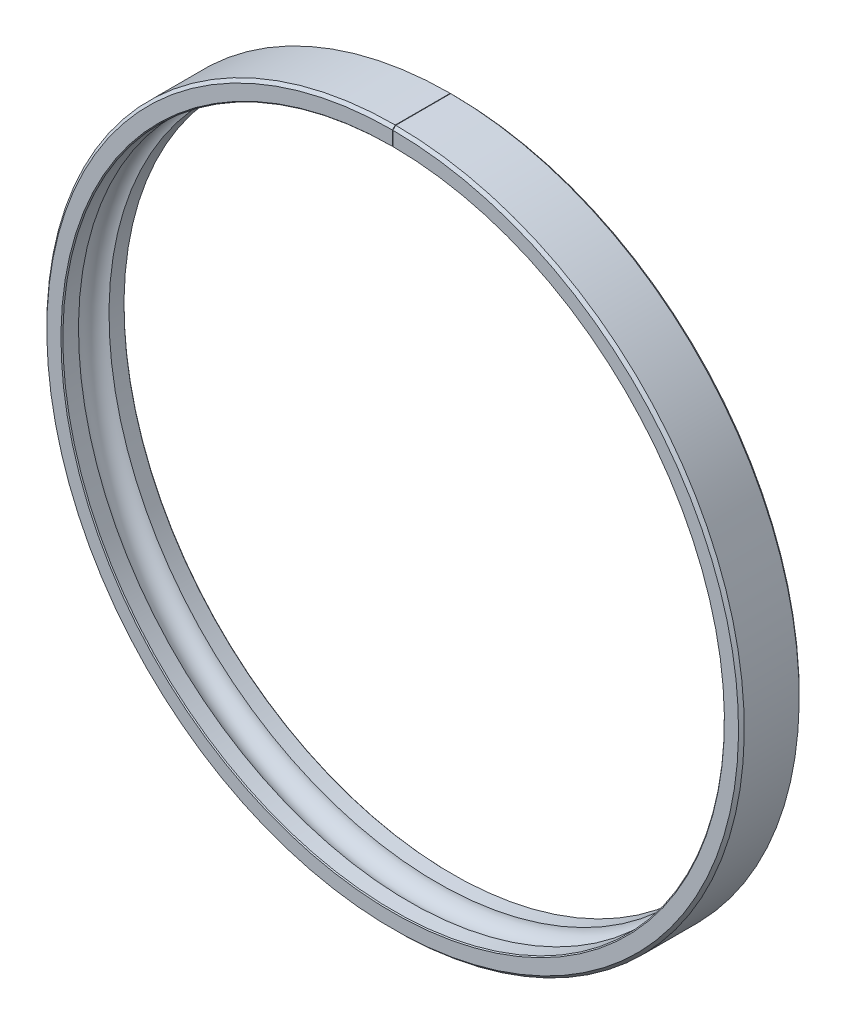
ISO-10303-21;
HEADER;
FILE_DESCRIPTION(('STEP AP214'),'2;1');
FILE_NAME('part.step','',(''),(''),'','','');
FILE_SCHEMA(('AUTOMOTIVE_DESIGN { 1 0 10303 214 1 1 1 1 }'));
ENDSEC;
DATA;
#1=APPLICATION_CONTEXT('core data for automotive mechanical design processes');
#2=APPLICATION_PROTOCOL_DEFINITION('international standard','automotive_design',2000,#1);
#3=PRODUCT_CONTEXT('',#1,'mechanical');
#4=PRODUCT('Part','Part','',(#3));
#5=PRODUCT_RELATED_PRODUCT_CATEGORY('part','',(#4));
#6=PRODUCT_DEFINITION_FORMATION('','',#4);
#7=PRODUCT_DEFINITION_CONTEXT('part definition',#1,'design');
#8=PRODUCT_DEFINITION('design','',#6,#7);
#9=PRODUCT_DEFINITION_SHAPE('','',#8);
#10=(LENGTH_UNIT() NAMED_UNIT(*) SI_UNIT(.MILLI.,.METRE.));
#11=(NAMED_UNIT(*) PLANE_ANGLE_UNIT() SI_UNIT($,.RADIAN.));
#12=(NAMED_UNIT(*) SI_UNIT($,.STERADIAN.) SOLID_ANGLE_UNIT());
#13=UNCERTAINTY_MEASURE_WITH_UNIT(LENGTH_MEASURE(1.E-05),#10,'distance_accuracy_value','');
#14=(GEOMETRIC_REPRESENTATION_CONTEXT(3) GLOBAL_UNCERTAINTY_ASSIGNED_CONTEXT((#13)) GLOBAL_UNIT_ASSIGNED_CONTEXT((#10,
#11,#12)) REPRESENTATION_CONTEXT('',''));
#15=CARTESIAN_POINT('',(0.,0.,0.));
#16=DIRECTION('',(0.,0.,1.));
#17=DIRECTION('',(1.,0.,0.));
#18=AXIS2_PLACEMENT_3D('',#15,#16,#17);
#19=CARTESIAN_POINT('',(0.,0.,6.35));
#20=DIRECTION('',(0.,0.,-1.));
#21=DIRECTION('',(0.,-1.,0.));
#22=AXIS2_PLACEMENT_3D('',#19,#20,#21);
#23=TOROIDAL_SURFACE('',#22,68.2625,3.05);
#24=CARTESIAN_POINT('',(0.0500000000000638,69.2624819527138,9.23140590684477));
#25=CARTESIAN_POINT('',(0.050030525655786,69.3021445084022,9.21764146303485));
#26=CARTESIAN_POINT('',(0.0500608491308224,69.3415224764377,9.20305712224508));
#27=CARTESIAN_POINT('',(0.0501210437003498,69.4196429515125,9.17227568197567));
#28=CARTESIAN_POINT('',(0.0501509147948409,69.4583854585518,9.15607858249601));
#29=CARTESIAN_POINT('',(0.0502101565841041,69.5351687259438,9.12209866011664));
#30=CARTESIAN_POINT('',(0.0502395272788762,69.5732094862964,9.10431583721692));
#31=CARTESIAN_POINT('',(0.0502977212957642,69.6485244614319,9.06719494375893));
#32=CARTESIAN_POINT('',(0.0503265446178802,69.6857986762148,9.04785687320065));
#33=CARTESIAN_POINT('',(0.0503835977845907,69.7595169905131,9.00765841448871));
#34=CARTESIAN_POINT('',(0.0504118276291853,69.7959610900284,8.98679802633504));
#35=CARTESIAN_POINT('',(0.0504676487523082,69.8679570402999,8.94359051097647));
#36=CARTESIAN_POINT('',(0.0504952400308367,69.9035088910561,8.92124338377155));
#37=CARTESIAN_POINT('',(0.050549740007951,69.9736597260341,8.87510048959892));
#38=CARTESIAN_POINT('',(0.050576648706537,70.0082587102559,8.8513047226312));
#39=CARTESIAN_POINT('',(0.050629740665029,70.0764448205423,8.80230512197826));
#40=CARTESIAN_POINT('',(0.050655923924935,70.1100319466069,8.77710128829302));
#41=CARTESIAN_POINT('',(0.0507075233743507,70.1761370737926,8.72532852701363));
#42=CARTESIAN_POINT('',(0.0507329395638605,70.2086550749139,8.69875959941946));
#43=CARTESIAN_POINT('',(0.0507829645395157,70.272566508413,8.64430195091496));
#44=CARTESIAN_POINT('',(0.0508075733256612,70.3039599407909,8.61641323000463));
#45=CARTESIAN_POINT('',(0.0508559445292228,70.365568710386,8.55936354566062));
#46=CARTESIAN_POINT('',(0.050879706946639,70.3957840476033,8.53020258222694));
#47=CARTESIAN_POINT('',(0.0509263478819175,70.4549851091426,8.47065813284674));
#48=CARTESIAN_POINT('',(0.0509492263997798,70.4839708334647,8.44027464690021));
#49=CARTESIAN_POINT('',(0.0509940635038742,70.5406632479907,8.37833695692406));
#50=CARTESIAN_POINT('',(0.0510160220901062,70.5683699381947,8.34678275289444));
#51=CARTESIAN_POINT('',(0.051058984859449,70.6224570440402,8.28255742728025));
#52=CARTESIAN_POINT('',(0.0510799890425598,70.6488374596817,8.24988630569568));
#53=CARTESIAN_POINT('',(0.0511210101538711,70.7002270372814,8.18348284986536));
#54=CARTESIAN_POINT('',(0.0511410270820716,70.7252361992396,8.14975051561961));
#55=CARTESIAN_POINT('',(0.0511800425079035,70.7738406283661,8.08128214874891));
#56=CARTESIAN_POINT('',(0.051199041005535,70.7974358955343,8.04654611612396));
#57=CARTESIAN_POINT('',(0.0512359901241783,70.843172304692,7.97612957810195));
#58=CARTESIAN_POINT('',(0.0512539407451903,70.8653134466815,7.9404490727049));
#59=CARTESIAN_POINT('',(0.0512887664447982,70.9081038544044,7.86820442509012));
#60=CARTESIAN_POINT('',(0.0513056415233942,70.9287531201379,7.83164028287239));
#61=CARTESIAN_POINT('',(0.0513382903002489,70.9685245679495,7.75769070418555));
#62=CARTESIAN_POINT('',(0.0513540639985076,70.9876467500277,7.72030526771644));
#63=CARTESIAN_POINT('',(0.0513844860490516,71.0243314268364,7.6447768434187));
#64=CARTESIAN_POINT('',(0.0513991344013368,71.041893921567,7.60663385559008));
#65=CARTESIAN_POINT('',(0.0514272837079143,71.0754292792855,7.52965536310489));
#66=CARTESIAN_POINT('',(0.0514407846622066,71.0914021422733,7.49081985844832));
#67=CARTESIAN_POINT('',(0.051466619072412,71.1217310024642,7.41252254759341));
#68=CARTESIAN_POINT('',(0.0514789525283252,71.1360869996671,7.37306074139507));
#69=CARTESIAN_POINT('',(0.0515024338277933,71.1631576510332,7.29357811059899));
#70=CARTESIAN_POINT('',(0.0515135816713484,71.1758723051963,7.25355728600126));
#71=CARTESIAN_POINT('',(0.0515346756497387,71.1996385917496,7.17302485468597));
#72=CARTESIAN_POINT('',(0.0515446217845741,71.2106902241397,7.13251324796842));
#73=CARTESIAN_POINT('',(0.0515632982949019,71.2311116238979,7.05106832548607));
#74=CARTESIAN_POINT('',(0.0515720286703944,71.240481391266,7.01013500972127));
#75=CARTESIAN_POINT('',(0.051588261681291,71.2575230853435,6.92791646123908));
#76=CARTESIAN_POINT('',(0.051595764316695,71.265195012053,6.88663122852168));
#77=CARTESIAN_POINT('',(0.0516095319578043,71.2788279440279,6.80377923825414));
#78=CARTESIAN_POINT('',(0.0516157969635095,71.2847889492934,6.762212480704));
#79=CARTESIAN_POINT('',(0.0516270815636984,71.2949898747489,6.67886831289611));
#80=CARTESIAN_POINT('',(0.051632101158182,71.299229794939,6.63709090263836));
#81=CARTESIAN_POINT('',(0.051640889276542,71.3059813210958,6.55339666070734));
#82=CARTESIAN_POINT('',(0.0516446578004184,71.3084929270626,6.51147982903406));
#83=CARTESIAN_POINT('',(0.0516509402503211,71.3117835424339,6.42757821328026));
#84=CARTESIAN_POINT('',(0.0516534541763473,71.3125625518385,6.38559342919974));
#85=CARTESIAN_POINT('',(0.051657226041898,71.3123866458574,6.3016274934999));
#86=CARTESIAN_POINT('',(0.0516584839814225,71.3114317304716,6.25964634188058));
#87=CARTESIAN_POINT('',(0.0516597446268951,71.3077896030568,6.1757592497782));
#88=CARTESIAN_POINT('',(0.0516597473328433,71.3051023910278,6.13385330929512));
#89=CARTESIAN_POINT('',(0.0516585004047623,71.2980002520729,6.05018808990382));
#90=CARTESIAN_POINT('',(0.0516572507707331,71.2935853251469,6.00842881099558));
#91=CARTESIAN_POINT('',(0.0516535041925529,71.2830352839318,5.92512811513172));
#92=CARTESIAN_POINT('',(0.051651007248402,71.2769001696426,5.8835866981761));
#93=CARTESIAN_POINT('',(0.0516447732080313,71.2629202141874,5.8007925551364));
#94=CARTESIAN_POINT('',(0.0516410361118115,71.2550753730213,5.75953982905232));
#95=CARTESIAN_POINT('',(0.0516323310417225,71.237689339416,5.67739340445113));
#96=CARTESIAN_POINT('',(0.0516273630678532,71.2281481469767,5.63649970593402));
#97=CARTESIAN_POINT('',(0.0516162076180486,71.2073856787405,5.55514106101323));
#98=CARTESIAN_POINT('',(0.0516100201421133,71.1961644029436,5.51467611460956));
#99=CARTESIAN_POINT('',(0.0515964391459497,71.172060900482,5.43424396743148));
#100=CARTESIAN_POINT('',(0.0515890456257215,71.1591786738173,5.39427676665708));
#101=CARTESIAN_POINT('',(0.0515730680583356,71.1317752340637,5.31490825558747));
#102=CARTESIAN_POINT('',(0.0515644840111779,71.1172540209748,5.27550694529225));
#103=CARTESIAN_POINT('',(0.0515461429411725,71.0865973673195,5.19733739517672));
#104=CARTESIAN_POINT('',(0.0515363859183247,71.0704619267531,5.1585691553564));
#105=CARTESIAN_POINT('',(0.051515718452274,71.036604329379,5.08173184678897));
#106=CARTESIAN_POINT('',(0.0515048080090711,71.0188821725712,5.04366277804185));
#107=CARTESIAN_POINT('',(0.0514818552289837,70.981881359332,4.96828872011895));
#108=CARTESIAN_POINT('',(0.0514698128920992,70.9626027029006,4.93098373094316));
#109=CARTESIAN_POINT('',(0.0514446197865354,70.9225217608939,4.85720143789057));
#110=CARTESIAN_POINT('',(0.051431469017856,70.9017194753186,4.82072413401378));
#111=CARTESIAN_POINT('',(0.0514040844059174,70.8586267433211,4.74865940606743));
#112=CARTESIAN_POINT('',(0.0513898505626581,70.8363362968988,4.71307198199788));
#113=CARTESIAN_POINT('',(0.051360327011582,70.7903052488473,4.64284769091198));
#114=CARTESIAN_POINT('',(0.0513450373037653,70.766564647218,4.60821082389563));
#115=CARTESIAN_POINT('',(0.0513134310402567,70.717673766935,4.53994670344396));
#116=CARTESIAN_POINT('',(0.0512971144845648,70.6925234882812,4.50631945000864));
#117=CARTESIAN_POINT('',(0.0512634852996267,70.6408561356583,4.44013189183617));
#118=CARTESIAN_POINT('',(0.0512461726703804,70.6143390616892,4.40757158709902));
#119=CARTESIAN_POINT('',(0.0512105838182275,70.5599833305571,4.34357344227189));
#120=CARTESIAN_POINT('',(0.0511923075953208,70.5321446733942,4.3121356021819));
#121=CARTESIAN_POINT('',(0.0511548256862512,70.475193241321,4.25043598877415));
#122=CARTESIAN_POINT('',(0.0511356200000882,70.4460804664107,4.22017421545639));
#123=CARTESIAN_POINT('',(0.0510963148876269,70.3866304366846,4.16087833250159));
#124=CARTESIAN_POINT('',(0.0510762154613287,70.3562931818688,4.13184422286455));
#125=CARTESIAN_POINT('',(0.0510351601239131,70.2944459179355,4.07505317098938));
#126=CARTESIAN_POINT('',(0.0510142042127958,70.2629359088179,4.04729622875125));
#127=CARTESIAN_POINT('',(0.0509714746300061,70.1987968614535,3.9931068377969));
#128=CARTESIAN_POINT('',(0.0509497009583338,70.1661678232066,3.96667438908069));
#129=CARTESIAN_POINT('',(0.0509053759819623,70.0998463507223,3.9151790530065));
#130=CARTESIAN_POINT('',(0.0508828246772632,70.0661539164849,3.89011616564852));
#131=CARTESIAN_POINT('',(0.0508369858975552,69.9977630982692,3.84140268499707));
#132=CARTESIAN_POINT('',(0.0508136984225464,69.963064714291,3.81775209170359));
#133=CARTESIAN_POINT('',(0.05076643002961,69.8927211580059,3.77190352390426));
#134=CARTESIAN_POINT('',(0.0507424491116825,69.8570759856991,3.74970554939839));
#135=CARTESIAN_POINT('',(0.0506938377525472,69.784899628466,3.70680006713365));
#136=CARTESIAN_POINT('',(0.0506692073113395,69.7483684435397,3.68609255937477));
#137=CARTESIAN_POINT('',(0.0506193419427793,69.6744823474292,3.64620331736566));
#138=CARTESIAN_POINT('',(0.0505941070154267,69.637127436245,3.62702158311543));
#139=CARTESIAN_POINT('',(0.0505430787527511,69.5616575785094,3.59021659312503));
#140=CARTESIAN_POINT('',(0.050517285417428,69.523542631958,3.57259333738486));
#141=CARTESIAN_POINT('',(0.0504651873794979,69.4466176900301,3.53893535325075));
#142=CARTESIAN_POINT('',(0.0504388826768908,69.4078076946535,3.5229006248568));
#143=CARTESIAN_POINT('',(0.050385809828296,69.3295588275238,3.49244703178549));
#144=CARTESIAN_POINT('',(0.0503590416823083,69.2901199557706,3.47802816710811));
#145=CARTESIAN_POINT('',(0.0503050906696579,69.2106805774668,3.45083089767457));
#146=CARTESIAN_POINT('',(0.0502779078029953,69.1706800709161,3.43805249291839));
#147=CARTESIAN_POINT('',(0.050223176798813,69.090185633823,3.41415788685942));
#148=CARTESIAN_POINT('',(0.0501956286612932,69.0496917032806,3.40304168555662));
#149=CARTESIAN_POINT('',(0.0501402171660001,68.9682794269088,3.38249060356065));
#150=CARTESIAN_POINT('',(0.0501123538082267,68.9273610810794,3.37305572286747));
#151=CARTESIAN_POINT('',(0.0500563625958498,68.8451698684404,3.35588275736711));
#152=CARTESIAN_POINT('',(0.0500282347412464,68.8038970016309,3.34814467255993));
#153=CARTESIAN_POINT('',(0.0499999999999397,68.7624818214846,3.34126272333392));
#154=B_SPLINE_CURVE_WITH_KNOTS('',3,(#24,#25,#26,#27,#28,#29,#30,#31,#32,#33,#34,#35,#36,#37,
#38,#39,#40,#41,#42,#43,#44,#45,#46,#47,#48,#49,#50,#51,#52,#53,#54,#55,#56,#57,#58,#59,#60,#61,
#62,#63,#64,#65,#66,#67,#68,#69,#70,#71,#72,#73,#74,#75,#76,#77,#78,#79,#80,#81,#82,#83,#84,#85,
#86,#87,#88,#89,#90,#91,#92,#93,#94,#95,#96,#97,#98,#99,#100,#101,#102,#103,#104,#105,#106,#107,
#108,#109,#110,#111,#112,#113,#114,#115,#116,#117,#118,#119,#120,#121,#122,#123,#124,#125,#126,
#127,#128,#129,#130,#131,#132,#133,#134,#135,#136,#137,#138,#139,#140,#141,#142,#143,#144,#145,
#146,#147,#148,#149,#150,#151,#152,#153),.UNSPECIFIED.,.F.,.F.,(4,2,2,2,2,2,2,2,2,2,2,2,2,2,2,2,
2,2,2,2,2,2,2,2,2,2,2,2,2,2,2,2,2,2,2,2,2,2,2,2,2,2,2,2,2,2,2,2,2,2,2,2,2,2,2,2,2,2,2,2,2,2,2,2,
4),(0.,0.125940233270192,0.251880466540797,0.377820699811841,0.503760933083308,
0.629701166355175,0.755641399627453,0.881581632900125,1.00752186617318,1.13346209944661,
1.2594023327204,1.38534256599453,1.51128279926899,1.63722303254376,1.76316326581886,
1.88910349909425,2.0150437323699,2.14098396564582,2.26692419892199,2.39286443219837,
2.51880466547496,2.64474489875175,2.77068513202871,2.89662536530582,3.02256559858307,
3.14850583186043,3.27444606513789,3.40038629841543,3.52632653169303,3.65226676497066,
3.77820699824832,3.90414723152597,4.03008746480361,4.1560276980812,4.28196793135873,
4.40790816463618,4.53384839791354,4.65978863119078,4.78572886446787,4.91166909774481,
5.03760933102158,5.16354956429815,5.28948979757452,5.41543003085065,5.54137026412655,
5.66731049740218,5.79325073067752,5.91919096395259,6.04513119722734,6.17107143050177,
6.29701166377588,6.42295189704962,6.54889213032301,6.67483236359602,6.80077259686864,
6.9267128301409,7.05265306341272,7.17859329668415,7.30453352995514,7.43047376322572,
7.55641399649585,7.68235422976555,7.80829446303479,7.93423469630359,8.06017492957194),.UNSPECIFIED.);
#155=CARTESIAN_POINT('',(0.0499999999999976,69.2624819527138,9.23140590684478));
#156=VERTEX_POINT('',#155);
#157=CARTESIAN_POINT('',(0.0499999999999977,68.7624818214846,3.34126272333392));
#158=VERTEX_POINT('',#157);
#159=EDGE_CURVE('E164',#156,#158,#154,.T.);
#160=ORIENTED_EDGE('',*,*,#159,.T.);
#161=CARTESIAN_POINT('',(0.,0.,3.34126272333392));
#162=DIRECTION('',(0.,0.,-1.));
#163=DIRECTION('',(1.,0.,0.));
#164=AXIS2_PLACEMENT_3D('',#161,#162,#163);
#165=CIRCLE('',#164,68.7625);
#166=CARTESIAN_POINT('',(-0.0500000000000006,68.7624818214846,3.34126272333392));
#167=VERTEX_POINT('',#166);
#168=EDGE_CURVE('E79',#158,#167,#165,.T.);
#169=ORIENTED_EDGE('',*,*,#168,.T.);
#170=CARTESIAN_POINT('',(-0.0500000000000735,68.7624818214846,3.34126272333392));
#171=CARTESIAN_POINT('',(-0.0500282347414037,68.8038970016309,3.34814467255993));
#172=CARTESIAN_POINT('',(-0.050056362595998,68.8451698684404,3.35588275736711));
#173=CARTESIAN_POINT('',(-0.0501123538083464,68.9273610810794,3.37305572286747));
#174=CARTESIAN_POINT('',(-0.0501402171661004,68.9682794269088,3.38249060356065));
#175=CARTESIAN_POINT('',(-0.0501956286614,69.0496917032806,3.40304168555662));
#176=CARTESIAN_POINT('',(-0.0502231767989454,69.090185633823,3.41415788685942));
#177=CARTESIAN_POINT('',(-0.0502779078031317,69.1706800709161,3.43805249291839));
#178=CARTESIAN_POINT('',(-0.0503050906697726,69.2106805774668,3.45083089767457));
#179=CARTESIAN_POINT('',(-0.0503590416824014,69.2901199557706,3.47802816710811));
#180=CARTESIAN_POINT('',(-0.0503858098283894,69.3295588275238,3.49244703178549));
#181=CARTESIAN_POINT('',(-0.0504388826770057,69.4078076946535,3.5229006248568));
#182=CARTESIAN_POINT('',(-0.050465187379634,69.4466176900301,3.53893535325075));
#183=CARTESIAN_POINT('',(-0.0505172854175621,69.523542631958,3.57259333738486));
#184=CARTESIAN_POINT('',(-0.0505430787528619,69.5616575785094,3.59021659312503));
#185=CARTESIAN_POINT('',(-0.0505941070155247,69.637127436245,3.62702158311543));
#186=CARTESIAN_POINT('',(-0.0506193419428876,69.6744823474292,3.64620331736566));
#187=CARTESIAN_POINT('',(-0.0506692073114404,69.7483684435397,3.68609255937477));
#188=CARTESIAN_POINT('',(-0.0506938377526301,69.784899628466,3.70680006713365));
#189=CARTESIAN_POINT('',(-0.0507424491117471,69.8570759856991,3.74970554939839));
#190=CARTESIAN_POINT('',(-0.0507664300296742,69.8927211580059,3.77190352390426));
#191=CARTESIAN_POINT('',(-0.0508136984226299,69.963064714291,3.81775209170359));
#192=CARTESIAN_POINT('',(-0.0508369858976584,69.9977630982692,3.84140268499707));
#193=CARTESIAN_POINT('',(-0.0508828246773702,70.0661539164849,3.89011616564852));
#194=CARTESIAN_POINT('',(-0.0509053759820534,70.0998463507223,3.9151790530065));
#195=CARTESIAN_POINT('',(-0.0509497009583908,70.1661678232066,3.96667438908069));
#196=CARTESIAN_POINT('',(-0.0509714746300451,70.1987968614535,3.9931068377969));
#197=CARTESIAN_POINT('',(-0.0510142042128428,70.2629359088179,4.04729622875125));
#198=CARTESIAN_POINT('',(-0.0510351601239863,70.2944459179355,4.07505317098938));
#199=CARTESIAN_POINT('',(-0.051076215461404,70.3562931818688,4.13184422286455));
#200=CARTESIAN_POINT('',(-0.0510963148876782,70.3866304366846,4.16087833250159));
#201=CARTESIAN_POINT('',(-0.0511356200001232,70.4460804664107,4.22017421545639));
#202=CARTESIAN_POINT('',(-0.0511548256862941,70.475193241321,4.25043598877415));
#203=CARTESIAN_POINT('',(-0.0511923075953642,70.5321446733942,4.3121356021819));
#204=CARTESIAN_POINT('',(-0.0512105838182635,70.5599833305571,4.34357344227189));
#205=CARTESIAN_POINT('',(-0.0512461726704308,70.6143390616892,4.40757158709902));
#206=CARTESIAN_POINT('',(-0.051263485299699,70.6408561356583,4.44013189183617));
#207=CARTESIAN_POINT('',(-0.0512971144846419,70.6925234882812,4.50631945000864));
#208=CARTESIAN_POINT('',(-0.0513134310403166,70.717673766935,4.53994670344396));
#209=CARTESIAN_POINT('',(-0.0513450373037919,70.766564647218,4.60821082389563));
#210=CARTESIAN_POINT('',(-0.0513603270115926,70.7903052488473,4.64284769091198));
#211=CARTESIAN_POINT('',(-0.0513898505626713,70.8363362968988,4.71307198199788));
#212=CARTESIAN_POINT('',(-0.0514040844059495,70.8586267433211,4.74865940606743));
#213=CARTESIAN_POINT('',(-0.0514314690179107,70.9017194753186,4.82072413401378));
#214=CARTESIAN_POINT('',(-0.0514446197865936,70.9225217608939,4.85720143789057));
#215=CARTESIAN_POINT('',(-0.0514698128921279,70.9626027029006,4.93098373094316));
#216=CARTESIAN_POINT('',(-0.0514818552289791,70.981881359332,4.96828872011895));
#217=CARTESIAN_POINT('',(-0.0515048080090365,71.0188821725712,5.04366277804185));
#218=CARTESIAN_POINT('',(-0.0515157184522425,71.036604329379,5.08173184678897));
#219=CARTESIAN_POINT('',(-0.051536385918317,71.0704619267531,5.1585691553564));
#220=CARTESIAN_POINT('',(-0.0515461429411853,71.0865973673195,5.19733739517672));
#221=CARTESIAN_POINT('',(-0.0515644840111889,71.1172540209748,5.27550694529225));
#222=CARTESIAN_POINT('',(-0.0515730680583242,71.1317752340637,5.31490825558747));
#223=CARTESIAN_POINT('',(-0.0515890456256936,71.1591786738173,5.39427676665708));
#224=CARTESIAN_POINT('',(-0.0515964391459279,71.172060900482,5.43424396743148));
#225=CARTESIAN_POINT('',(-0.0516100201420959,71.1961644029436,5.51467611460956));
#226=CARTESIAN_POINT('',(-0.0516162076180296,71.2073856787405,5.55514106101323));
#227=CARTESIAN_POINT('',(-0.0516273630678329,71.2281481469767,5.63649970593402));
#228=CARTESIAN_POINT('',(-0.0516323310417026,71.237689339416,5.67739340445113));
#229=CARTESIAN_POINT('',(-0.0516410361117921,71.2550753730213,5.75953982905232));
#230=CARTESIAN_POINT('',(-0.051644773208012,71.2629202141874,5.8007925551364));
#231=CARTESIAN_POINT('',(-0.0516510072483821,71.2769001696426,5.8835866981761));
#232=CARTESIAN_POINT('',(-0.0516535041925322,71.2830352839318,5.92512811513172));
#233=CARTESIAN_POINT('',(-0.0516572507707144,71.2935853251469,6.00842881099558));
#234=CARTESIAN_POINT('',(-0.0516585004047465,71.2980002520729,6.05018808990382));
#235=CARTESIAN_POINT('',(-0.0516597473328198,71.3051023910278,6.13385330929512));
#236=CARTESIAN_POINT('',(-0.051659744626861,71.3077896030568,6.1757592497782));
#237=CARTESIAN_POINT('',(-0.0516584839813538,71.3114317304716,6.25964634188058));
#238=CARTESIAN_POINT('',(-0.0516572260418054,71.3123866458574,6.3016274934999));
#239=CARTESIAN_POINT('',(-0.051653454176274,71.3125625518385,6.38559342919974));
#240=CARTESIAN_POINT('',(-0.051650940250291,71.3117835424339,6.42757821328026));
#241=CARTESIAN_POINT('',(-0.0516446578004091,71.3084929270626,6.51147982903406));
#242=CARTESIAN_POINT('',(-0.0516408892765102,71.3059813210958,6.55339666070734));
#243=CARTESIAN_POINT('',(-0.051632101158111,71.299229794939,6.63709090263836));
#244=CARTESIAN_POINT('',(-0.0516270815636107,71.2949898747489,6.67886831289611));
#245=CARTESIAN_POINT('',(-0.0516157969634312,71.2847889492934,6.762212480704));
#246=CARTESIAN_POINT('',(-0.0516095319577521,71.2788279440279,6.80377923825414));
#247=CARTESIAN_POINT('',(-0.0515957643166446,71.265195012053,6.88663122852168));
#248=CARTESIAN_POINT('',(-0.0515882616812161,71.2575230853435,6.92791646123908));
#249=CARTESIAN_POINT('',(-0.0515720286703033,71.240481391266,7.01013500972127));
#250=CARTESIAN_POINT('',(-0.0515632982948189,71.2311116238979,7.05106832548607));
#251=CARTESIAN_POINT('',(-0.0515446217844913,71.2106902241397,7.13251324796842));
#252=CARTESIAN_POINT('',(-0.0515346756496481,71.1996385917496,7.17302485468597));
#253=CARTESIAN_POINT('',(-0.0515135816712733,71.1758723051963,7.25355728600126));
#254=CARTESIAN_POINT('',(-0.0515024338277418,71.1631576510332,7.29357811059899));
#255=CARTESIAN_POINT('',(-0.0514789525282743,71.1360869996671,7.37306074139507));
#256=CARTESIAN_POINT('',(-0.0514666190723383,71.1217310024642,7.41252254759341));
#257=CARTESIAN_POINT('',(-0.0514407846621148,71.0914021422733,7.49081985844832));
#258=CARTESIAN_POINT('',(-0.0514272837078273,71.0754292792855,7.52965536310489));
#259=CARTESIAN_POINT('',(-0.0513991344012583,71.041893921567,7.60663385559008));
#260=CARTESIAN_POINT('',(-0.0513844860489767,71.0243314268364,7.6447768434187));
#261=CARTESIAN_POINT('',(-0.0513540639984171,70.9876467500277,7.72030526771644));
#262=CARTESIAN_POINT('',(-0.0513382903001391,70.9685245679495,7.75769070418555));
#263=CARTESIAN_POINT('',(-0.0513056415232758,70.9287531201379,7.83164028287239));
#264=CARTESIAN_POINT('',(-0.0512887664446907,70.9081038544044,7.86820442509012));
#265=CARTESIAN_POINT('',(-0.0512539407450697,70.8653134466815,7.9404490727049));
#266=CARTESIAN_POINT('',(-0.0512359901240339,70.843172304692,7.97612957810195));
#267=CARTESIAN_POINT('',(-0.0511990410053887,70.7974358955343,8.04654611612396));
#268=CARTESIAN_POINT('',(-0.0511800425077793,70.7738406283661,8.08128214874891));
#269=CARTESIAN_POINT('',(-0.0511410270819683,70.7252361992396,8.14975051561961));
#270=CARTESIAN_POINT('',(-0.0511210101537668,70.7002270372814,8.18348284986536));
#271=CARTESIAN_POINT('',(-0.0510799890424368,70.6488374596817,8.24988630569568));
#272=CARTESIAN_POINT('',(-0.0510589848593083,70.6224570440402,8.28255742728025));
#273=CARTESIAN_POINT('',(-0.0510160220899571,70.5683699381947,8.34678275289444));
#274=CARTESIAN_POINT('',(-0.0509940635037344,70.5406632479907,8.37833695692406));
#275=CARTESIAN_POINT('',(-0.0509492263996301,70.4839708334647,8.44027464690021));
#276=CARTESIAN_POINT('',(-0.0509263478817487,70.4549851091426,8.47065813284674));
#277=CARTESIAN_POINT('',(-0.0508797069464562,70.3957840476033,8.53020258222694));
#278=CARTESIAN_POINT('',(-0.0508559445290451,70.365568710386,8.55936354566062));
#279=CARTESIAN_POINT('',(-0.0508075733254877,70.3039599407909,8.61641323000463));
#280=CARTESIAN_POINT('',(-0.0507829645393414,70.272566508413,8.64430195091496));
#281=CARTESIAN_POINT('',(-0.0507329395636841,70.2086550749139,8.69875959941946));
#282=CARTESIAN_POINT('',(-0.0507075233741732,70.1761370737926,8.72532852701363));
#283=CARTESIAN_POINT('',(-0.0506559239247623,70.1100319466069,8.77710128829302));
#284=CARTESIAN_POINT('',(-0.0506297406648624,70.0764448205423,8.80230512197826));
#285=CARTESIAN_POINT('',(-0.0505766487063539,70.0082587102559,8.8513047226312));
#286=CARTESIAN_POINT('',(-0.0505497400077453,69.9736597260341,8.87510048959892));
#287=CARTESIAN_POINT('',(-0.0504952400306311,69.9035088910561,8.92124338377155));
#288=CARTESIAN_POINT('',(-0.0504676487521254,69.8679570402999,8.94359051097647));
#289=CARTESIAN_POINT('',(-0.0504118276290195,69.7959610900284,8.98679802633504));
#290=CARTESIAN_POINT('',(-0.0503835977844192,69.7595169905131,9.00765841448871));
#291=CARTESIAN_POINT('',(-0.0503265446177036,69.6857986762148,9.04785687320065));
#292=CARTESIAN_POINT('',(-0.0502977212955883,69.6485244614319,9.06719494375893));
#293=CARTESIAN_POINT('',(-0.0502395272787046,69.5732094862964,9.10431583721692));
#294=CARTESIAN_POINT('',(-0.0502101565839362,69.5351687259438,9.12209866011664));
#295=CARTESIAN_POINT('',(-0.0501509147946618,69.4583854585518,9.15607858249601));
#296=CARTESIAN_POINT('',(-0.0501210437001557,69.4196429515125,9.17227568197567));
#297=CARTESIAN_POINT('',(-0.0500608491306085,69.3415224764377,9.20305712224508));
#298=CARTESIAN_POINT('',(-0.0500305256555674,69.3021445084022,9.21764146303485));
#299=CARTESIAN_POINT('',(-0.0499999999998602,69.2624819527138,9.23140590684477));
#300=B_SPLINE_CURVE_WITH_KNOTS('',3,(#170,#171,#172,#173,#174,#175,#176,#177,#178,#179,#180,
#181,#182,#183,#184,#185,#186,#187,#188,#189,#190,#191,#192,#193,#194,#195,#196,#197,#198,#199,
#200,#201,#202,#203,#204,#205,#206,#207,#208,#209,#210,#211,#212,#213,#214,#215,#216,#217,#218,
#219,#220,#221,#222,#223,#224,#225,#226,#227,#228,#229,#230,#231,#232,#233,#234,#235,#236,#237,
#238,#239,#240,#241,#242,#243,#244,#245,#246,#247,#248,#249,#250,#251,#252,#253,#254,#255,#256,
#257,#258,#259,#260,#261,#262,#263,#264,#265,#266,#267,#268,#269,#270,#271,#272,#273,#274,#275,
#276,#277,#278,#279,#280,#281,#282,#283,#284,#285,#286,#287,#288,#289,#290,#291,#292,#293,#294,
#295,#296,#297,#298,#299),.UNSPECIFIED.,.F.,.F.,(4,2,2,2,2,2,2,2,2,2,2,2,2,2,2,2,2,2,2,2,2,2,2,
2,2,2,2,2,2,2,2,2,2,2,2,2,2,2,2,2,2,2,2,2,2,2,2,2,2,2,2,2,2,2,2,2,2,2,2,2,2,2,2,2,4),(0.,
0.125940233268354,0.25188046653715,0.37782069980639,0.503760933076089,0.629701166346223,
0.755641399616799,0.881581632887799,1.00752186615922,1.13346209943105,1.2594023327033,
1.38534256597592,1.51128279924894,1.63722303252233,1.76316326579607,1.88910349907017,
2.0150437323446,2.14098396561935,2.26692419889442,2.39286443216976,2.5188046654454,
2.64474489872129,2.77068513199743,2.89662536527379,3.02256559855036,3.14850583182713,
3.27444606510407,3.40038629838117,3.52632653165841,3.65226676493576,3.77820699821321,
3.90414723149075,4.03008746476834,4.15602769804597,4.28196793132363,4.40790816460128,
4.53384839787892,4.65978863115652,4.78572886443406,4.91166909771152,5.03760933098888,
5.16354956426613,5.28948979754324,5.4154300308202,5.54137026409698,5.66731049737358,
5.79325073064996,5.91919096392613,6.04513119720205,6.1710714304777,6.29701166375308,
6.42295189702818,6.54889213030295,6.67483236357742,6.80077259685155,6.92671283012533,
7.05265306339876,7.17859329667182,7.30453352994449,7.43047376321677,7.55641399648864,
7.6823542297601,7.80829446303115,7.93423469630175,8.06017492957194),.UNSPECIFIED.);
#301=CARTESIAN_POINT('',(-0.0500000000000008,69.2624819527138,9.23140590684478));
#302=VERTEX_POINT('',#301);
#303=EDGE_CURVE('E154',#167,#302,#300,.T.);
#304=ORIENTED_EDGE('',*,*,#303,.T.);
#305=CARTESIAN_POINT('',(0.,0.,9.23140590684478));
#306=DIRECTION('',(0.,0.,-1.));
#307=DIRECTION('',(1.,0.,0.));
#308=AXIS2_PLACEMENT_3D('',#305,#306,#307);
#309=CIRCLE('',#308,69.2625);
#310=EDGE_CURVE('E11',#156,#302,#309,.T.);
#311=ORIENTED_EDGE('',*,*,#310,.F.);
#312=EDGE_LOOP('',(#160,#169,#304,#311));
#313=FACE_BOUND('',#312,.T.);
#314=ADVANCED_FACE('F16',(#313),#23,.F.);
#315=CARTESIAN_POINT('',(0.,0.,10.9657029534224));
#316=DIRECTION('',(0.,0.,-1.));
#317=DIRECTION('',(0.,-1.,0.));
#318=AXIS2_PLACEMENT_3D('',#315,#316,#317);
#319=CYLINDRICAL_SURFACE('',#318,69.2625);
#320=DIRECTION('',(0.,0.,-1.));
#321=VECTOR('',#320,1.);
#322=CARTESIAN_POINT('',(0.0499999999999976,69.2624819527138,10.9657029534224));
#323=LINE('',#322,#321);
#324=CARTESIAN_POINT('',(0.0499999999999976,69.2624819527138,12.5));
#325=VERTEX_POINT('',#324);
#326=EDGE_CURVE('E280',#325,#156,#323,.T.);
#327=ORIENTED_EDGE('',*,*,#326,.T.);
#328=ORIENTED_EDGE('',*,*,#310,.T.);
#329=DIRECTION('',(0.,0.,1.));
#330=VECTOR('',#329,1.);
#331=CARTESIAN_POINT('',(-0.0500000000000008,69.2624819527138,10.9657029534224));
#332=LINE('',#331,#330);
#333=CARTESIAN_POINT('',(-0.0500000000000008,69.2624819527138,12.5));
#334=VERTEX_POINT('',#333);
#335=EDGE_CURVE('E207',#302,#334,#332,.T.);
#336=ORIENTED_EDGE('',*,*,#335,.T.);
#337=CARTESIAN_POINT('',(0.,0.,12.5));
#338=DIRECTION('',(0.,0.,-1.));
#339=DIRECTION('',(1.,0.,0.));
#340=AXIS2_PLACEMENT_3D('',#337,#338,#339);
#341=CIRCLE('',#340,69.2625);
#342=EDGE_CURVE('E28',#325,#334,#341,.T.);
#343=ORIENTED_EDGE('',*,*,#342,.F.);
#344=EDGE_LOOP('',(#327,#328,#336,#343));
#345=FACE_BOUND('',#344,.T.);
#346=ADVANCED_FACE('F180',(#345),#319,.F.);
#347=CARTESIAN_POINT('',(0.,0.,12.6));
#348=DIRECTION('',(0.,0.,1.));
#349=DIRECTION('',(0.,-1.,0.));
#350=AXIS2_PLACEMENT_3D('',#347,#348,#349);
#351=CONICAL_SURFACE('',#350,69.3625,0.785398163397437);
#352=DIRECTION('',(0.,-0.707106873044436,-0.707106689328648));
#353=VECTOR('',#352,1.);
#354=CARTESIAN_POINT('',(0.0499999999999976,69.3624819786951,12.6));
#355=LINE('',#354,#353);
#356=CARTESIAN_POINT('',(0.0499999999999976,69.4624820046765,12.7));
#357=VERTEX_POINT('',#356);
#358=EDGE_CURVE('E245',#357,#325,#355,.T.);
#359=ORIENTED_EDGE('',*,*,#358,.T.);
#360=ORIENTED_EDGE('',*,*,#342,.T.);
#361=DIRECTION('',(0.,0.707106873044436,0.707106689328648));
#362=VECTOR('',#361,1.);
#363=CARTESIAN_POINT('',(-0.0500000000000008,69.3624819786951,12.6));
#364=LINE('',#363,#362);
#365=CARTESIAN_POINT('',(-0.0500000000000008,69.4624820046765,12.7));
#366=VERTEX_POINT('',#365);
#367=EDGE_CURVE('E210',#334,#366,#364,.T.);
#368=ORIENTED_EDGE('',*,*,#367,.T.);
#369=CARTESIAN_POINT('',(0.,0.,12.7));
#370=DIRECTION('',(0.,0.,1.));
#371=DIRECTION('',(1.,0.,0.));
#372=AXIS2_PLACEMENT_3D('',#369,#370,#371);
#373=CIRCLE('',#372,69.4625);
#374=EDGE_CURVE('E42',#366,#357,#373,.T.);
#375=ORIENTED_EDGE('',*,*,#374,.T.);
#376=EDGE_LOOP('',(#359,#360,#368,#375));
#377=FACE_BOUND('',#376,.T.);
#378=ADVANCED_FACE('F307',(#377),#351,.F.);
#379=CARTESIAN_POINT('',(0.,0.,1.67063136166696));
#380=DIRECTION('',(0.,0.,-1.));
#381=DIRECTION('',(0.,-1.,0.));
#382=AXIS2_PLACEMENT_3D('',#379,#380,#381);
#383=CYLINDRICAL_SURFACE('',#382,68.7625);
#384=DIRECTION('',(0.,0.,-1.));
#385=VECTOR('',#384,1.);
#386=CARTESIAN_POINT('',(0.0499999999999977,68.7624818214846,1.67063136166696));
#387=LINE('',#386,#385);
#388=CARTESIAN_POINT('',(0.0499999999999977,68.7624818214846,0.2));
#389=VERTEX_POINT('',#388);
#390=EDGE_CURVE('E232',#158,#389,#387,.T.);
#391=ORIENTED_EDGE('',*,*,#390,.T.);
#392=CARTESIAN_POINT('',(0.,0.,0.2));
#393=DIRECTION('',(0.,0.,1.));
#394=DIRECTION('',(1.,0.,0.));
#395=AXIS2_PLACEMENT_3D('',#392,#393,#394);
#396=CIRCLE('',#395,68.7625);
#397=CARTESIAN_POINT('',(-0.0500000000000006,68.7624818214846,0.2));
#398=VERTEX_POINT('',#397);
#399=EDGE_CURVE('E159',#398,#389,#396,.T.);
#400=ORIENTED_EDGE('',*,*,#399,.F.);
#401=DIRECTION('',(0.,0.,1.));
#402=VECTOR('',#401,1.);
#403=CARTESIAN_POINT('',(-0.0500000000000006,68.7624818214846,1.67063136166696));
#404=LINE('',#403,#402);
#405=EDGE_CURVE('E147',#398,#167,#404,.T.);
#406=ORIENTED_EDGE('',*,*,#405,.T.);
#407=ORIENTED_EDGE('',*,*,#168,.F.);
#408=EDGE_LOOP('',(#391,#400,#406,#407));
#409=FACE_BOUND('',#408,.T.);
#410=ADVANCED_FACE('F182',(#409),#383,.F.);
#411=CARTESIAN_POINT('',(0.,0.,0.1));
#412=DIRECTION('',(0.,0.,-1.));
#413=DIRECTION('',(0.,-1.,0.));
#414=AXIS2_PLACEMENT_3D('',#411,#412,#413);
#415=CONICAL_SURFACE('',#414,68.8625,0.785398163397438);
#416=DIRECTION('',(0.,0.707106874383222,-0.707106687989861));
#417=VECTOR('',#416,1.);
#418=CARTESIAN_POINT('',(0.0499999999999977,68.8624818478446,0.1));
#419=LINE('',#418,#417);
#420=CARTESIAN_POINT('',(0.0499999999999977,68.9624818742046,0.));
#421=VERTEX_POINT('',#420);
#422=EDGE_CURVE('E127',#389,#421,#419,.T.);
#423=ORIENTED_EDGE('',*,*,#422,.T.);
#424=CARTESIAN_POINT('',(0.,0.,0.));
#425=DIRECTION('',(0.,0.,-1.));
#426=DIRECTION('',(1.,0.,0.));
#427=AXIS2_PLACEMENT_3D('',#424,#425,#426);
#428=CIRCLE('',#427,68.9625);
#429=CARTESIAN_POINT('',(-0.0500000000000007,68.9624818742046,0.));
#430=VERTEX_POINT('',#429);
#431=EDGE_CURVE('E120',#421,#430,#428,.T.);
#432=ORIENTED_EDGE('',*,*,#431,.T.);
#433=DIRECTION('',(0.,-0.707106874383222,0.707106687989861));
#434=VECTOR('',#433,1.);
#435=CARTESIAN_POINT('',(-0.0500000000000006,68.8624818478446,0.1));
#436=LINE('',#435,#434);
#437=EDGE_CURVE('E124',#430,#398,#436,.T.);
#438=ORIENTED_EDGE('',*,*,#437,.T.);
#439=ORIENTED_EDGE('',*,*,#399,.T.);
#440=EDGE_LOOP('',(#423,#432,#438,#439));
#441=FACE_BOUND('',#440,.T.);
#442=ADVANCED_FACE('F122',(#441),#415,.F.);
#443=CARTESIAN_POINT('',(0.,0.,12.7));
#444=DIRECTION('',(0.,0.,1.));
#445=DIRECTION('',(1.,0.,0.));
#446=AXIS2_PLACEMENT_3D('',#443,#444,#445);
#447=PLANE('',#446);
#448=DIRECTION('',(0.,-1.,0.));
#449=VECTOR('',#448,1.);
#450=CARTESIAN_POINT('',(0.0500000000000028,41.3396382644972,12.7));
#451=LINE('',#450,#449);
#452=CARTESIAN_POINT('',(0.0499999999999971,72.4249827407643,12.7));
#453=VERTEX_POINT('',#452);
#454=EDGE_CURVE('E242',#453,#357,#451,.T.);
#455=ORIENTED_EDGE('',*,*,#454,.T.);
#456=ORIENTED_EDGE('',*,*,#374,.F.);
#457=DIRECTION('',(0.,1.,0.));
#458=VECTOR('',#457,1.);
#459=CARTESIAN_POINT('',(-0.0499999999999895,32.6135577930972,12.7));
#460=LINE('',#459,#458);
#461=CARTESIAN_POINT('',(-0.0500000000000017,72.4249827407643,12.7));
#462=VERTEX_POINT('',#461);
#463=EDGE_CURVE('E217',#366,#462,#460,.T.);
#464=ORIENTED_EDGE('',*,*,#463,.T.);
#465=CARTESIAN_POINT('',(0.,0.,12.7));
#466=DIRECTION('',(0.,0.,-1.));
#467=DIRECTION('',(-1.,0.,0.));
#468=AXIS2_PLACEMENT_3D('',#465,#466,#467);
#469=CIRCLE('',#468,72.425);
#470=EDGE_CURVE('E235',#453,#462,#469,.T.);
#471=ORIENTED_EDGE('',*,*,#470,.F.);
#472=EDGE_LOOP('',(#455,#456,#464,#471));
#473=FACE_BOUND('',#472,.T.);
#474=ADVANCED_FACE('F323',(#473),#447,.T.);
#475=CARTESIAN_POINT('',(0.,0.,12.4));
#476=DIRECTION('',(0.,0.,-1.));
#477=DIRECTION('',(0.,-1.,0.));
#478=AXIS2_PLACEMENT_3D('',#475,#476,#477);
#479=CONICAL_SURFACE('',#478,72.725,0.785398163397444);
#480=DIRECTION('',(0.,-0.707106864747814,0.707106697625271));
#481=VECTOR('',#480,1.);
#482=CARTESIAN_POINT('',(0.049999999999997,72.7249828116684,12.4));
#483=LINE('',#482,#481);
#484=CARTESIAN_POINT('',(0.0499999999999969,73.0249828825725,12.1));
#485=VERTEX_POINT('',#484);
#486=EDGE_CURVE('E250',#485,#453,#483,.T.);
#487=ORIENTED_EDGE('',*,*,#486,.T.);
#488=ORIENTED_EDGE('',*,*,#470,.T.);
#489=DIRECTION('',(0.,0.707106864747814,-0.707106697625271));
#490=VECTOR('',#489,1.);
#491=CARTESIAN_POINT('',(-0.0500000000000018,72.7249828116684,12.4));
#492=LINE('',#491,#490);
#493=CARTESIAN_POINT('',(-0.0500000000000019,73.0249828825725,12.1));
#494=VERTEX_POINT('',#493);
#495=EDGE_CURVE('E224',#462,#494,#492,.T.);
#496=ORIENTED_EDGE('',*,*,#495,.T.);
#497=CARTESIAN_POINT('',(0.,0.,12.1));
#498=DIRECTION('',(0.,0.,1.));
#499=DIRECTION('',(-1.,0.,0.));
#500=AXIS2_PLACEMENT_3D('',#497,#498,#499);
#501=CIRCLE('',#500,73.025);
#502=EDGE_CURVE('E132',#494,#485,#501,.T.);
#503=ORIENTED_EDGE('',*,*,#502,.T.);
#504=EDGE_LOOP('',(#487,#488,#496,#503));
#505=FACE_BOUND('',#504,.T.);
#506=ADVANCED_FACE('F317',(#505),#479,.T.);
#507=CARTESIAN_POINT('',(0.,0.,0.));
#508=DIRECTION('',(0.,0.,1.));
#509=DIRECTION('',(0.,-1.,0.));
#510=AXIS2_PLACEMENT_3D('',#507,#508,#509);
#511=CYLINDRICAL_SURFACE('',#510,73.025);
#512=DIRECTION('',(0.,0.,1.));
#513=VECTOR('',#512,1.);
#514=CARTESIAN_POINT('',(0.0499999999999969,73.0249828825725,0.));
#515=LINE('',#514,#513);
#516=CARTESIAN_POINT('',(0.0499999999999969,73.0249828825725,0.6));
#517=VERTEX_POINT('',#516);
#518=EDGE_CURVE('E249',#517,#485,#515,.T.);
#519=ORIENTED_EDGE('',*,*,#518,.T.);
#520=ORIENTED_EDGE('',*,*,#502,.F.);
#521=DIRECTION('',(0.,0.,-1.));
#522=VECTOR('',#521,1.);
#523=CARTESIAN_POINT('',(-0.0500000000000019,73.0249828825725,0.));
#524=LINE('',#523,#522);
#525=CARTESIAN_POINT('',(-0.0500000000000019,73.0249828825725,0.6));
#526=VERTEX_POINT('',#525);
#527=EDGE_CURVE('E254',#494,#526,#524,.T.);
#528=ORIENTED_EDGE('',*,*,#527,.T.);
#529=CARTESIAN_POINT('',(0.,0.,0.6));
#530=DIRECTION('',(0.,0.,-1.));
#531=DIRECTION('',(-1.,0.,0.));
#532=AXIS2_PLACEMENT_3D('',#529,#530,#531);
#533=CIRCLE('',#532,73.025);
#534=EDGE_CURVE('E228',#517,#526,#533,.T.);
#535=ORIENTED_EDGE('',*,*,#534,.F.);
#536=EDGE_LOOP('',(#519,#520,#528,#535));
#537=FACE_BOUND('',#536,.T.);
#538=ADVANCED_FACE('F312',(#537),#511,.T.);
#539=CARTESIAN_POINT('',(0.,0.,0.));
#540=DIRECTION('',(0.,0.,1.));
#541=DIRECTION('',(1.,0.,0.));
#542=AXIS2_PLACEMENT_3D('',#539,#540,#541);
#543=PLANE('',#542);
#544=DIRECTION('',(0.,1.,0.));
#545=VECTOR('',#544,1.);
#546=CARTESIAN_POINT('',(0.0500000000000028,41.3396382644972,0.));
#547=LINE('',#546,#545);
#548=CARTESIAN_POINT('',(0.0499999999999971,72.4249827407643,0.));
#549=VERTEX_POINT('',#548);
#550=EDGE_CURVE('E233',#421,#549,#547,.T.);
#551=ORIENTED_EDGE('',*,*,#550,.T.);
#552=CARTESIAN_POINT('',(0.,0.,0.));
#553=DIRECTION('',(0.,0.,1.));
#554=DIRECTION('',(-1.,0.,0.));
#555=AXIS2_PLACEMENT_3D('',#552,#553,#554);
#556=CIRCLE('',#555,72.425);
#557=CARTESIAN_POINT('',(-0.0500000000000017,72.4249827407643,0.));
#558=VERTEX_POINT('',#557);
#559=EDGE_CURVE('E133',#558,#549,#556,.T.);
#560=ORIENTED_EDGE('',*,*,#559,.F.);
#561=DIRECTION('',(0.,-1.,0.));
#562=VECTOR('',#561,1.);
#563=CARTESIAN_POINT('',(-0.0499999999999895,32.6135577930972,0.));
#564=LINE('',#563,#562);
#565=EDGE_CURVE('E136',#558,#430,#564,.T.);
#566=ORIENTED_EDGE('',*,*,#565,.T.);
#567=ORIENTED_EDGE('',*,*,#431,.F.);
#568=EDGE_LOOP('',(#551,#560,#566,#567));
#569=FACE_BOUND('',#568,.T.);
#570=ADVANCED_FACE('F137',(#569),#543,.F.);
#571=CARTESIAN_POINT('',(0.,0.,0.3));
#572=DIRECTION('',(0.,0.,1.));
#573=DIRECTION('',(0.,-1.,0.));
#574=AXIS2_PLACEMENT_3D('',#571,#572,#573);
#575=CONICAL_SURFACE('',#574,72.725,0.785398163397445);
#576=DIRECTION('',(0.,0.707106864747809,0.707106697625277));
#577=VECTOR('',#576,1.);
#578=CARTESIAN_POINT('',(0.049999999999997,72.7249828116684,0.3));
#579=LINE('',#578,#577);
#580=EDGE_CURVE('E241',#549,#517,#579,.T.);
#581=ORIENTED_EDGE('',*,*,#580,.T.);
#582=ORIENTED_EDGE('',*,*,#534,.T.);
#583=DIRECTION('',(0.,-0.707106864747809,-0.707106697625277));
#584=VECTOR('',#583,1.);
#585=CARTESIAN_POINT('',(-0.0500000000000018,72.7249828116684,0.3));
#586=LINE('',#585,#584);
#587=EDGE_CURVE('E143',#526,#558,#586,.T.);
#588=ORIENTED_EDGE('',*,*,#587,.T.);
#589=ORIENTED_EDGE('',*,*,#559,.T.);
#590=EDGE_LOOP('',(#581,#582,#588,#589));
#591=FACE_BOUND('',#590,.T.);
#592=ADVANCED_FACE('F302',(#591),#575,.T.);
#593=CARTESIAN_POINT('',(0.0499999999999952,82.6792765289945,12.7));
#594=DIRECTION('',(1.,0.,0.));
#595=DIRECTION('',(0.,1.,0.));
#596=AXIS2_PLACEMENT_3D('',#593,#594,#595);
#597=PLANE('',#596);
#598=ORIENTED_EDGE('',*,*,#486,.F.);
#599=ORIENTED_EDGE('',*,*,#518,.F.);
#600=ORIENTED_EDGE('',*,*,#580,.F.);
#601=ORIENTED_EDGE('',*,*,#550,.F.);
#602=ORIENTED_EDGE('',*,*,#422,.F.);
#603=ORIENTED_EDGE('',*,*,#390,.F.);
#604=ORIENTED_EDGE('',*,*,#159,.F.);
#605=ORIENTED_EDGE('',*,*,#326,.F.);
#606=ORIENTED_EDGE('',*,*,#358,.F.);
#607=ORIENTED_EDGE('',*,*,#454,.F.);
#608=EDGE_LOOP('',(#598,#599,#600,#601,#602,#603,#604,#605,#606,#607));
#609=FACE_BOUND('',#608,.T.);
#610=ADVANCED_FACE('F293',(#609),#597,.F.);
#611=CARTESIAN_POINT('',(-0.05,65.2271155861945,12.7));
#612=DIRECTION('',(-1.,0.,0.));
#613=DIRECTION('',(0.,1.,0.));
#614=AXIS2_PLACEMENT_3D('',#611,#612,#613);
#615=PLANE('',#614);
#616=ORIENTED_EDGE('',*,*,#495,.F.);
#617=ORIENTED_EDGE('',*,*,#463,.F.);
#618=ORIENTED_EDGE('',*,*,#367,.F.);
#619=ORIENTED_EDGE('',*,*,#335,.F.);
#620=ORIENTED_EDGE('',*,*,#303,.F.);
#621=ORIENTED_EDGE('',*,*,#405,.F.);
#622=ORIENTED_EDGE('',*,*,#437,.F.);
#623=ORIENTED_EDGE('',*,*,#565,.F.);
#624=ORIENTED_EDGE('',*,*,#587,.F.);
#625=ORIENTED_EDGE('',*,*,#527,.F.);
#626=EDGE_LOOP('',(#616,#617,#618,#619,#620,#621,#622,#623,#624,#625));
#627=FACE_BOUND('',#626,.T.);
#628=ADVANCED_FACE('F18',(#627),#615,.F.);
#629=CLOSED_SHELL('',(#314,#346,#378,#410,#442,#474,#506,#538,#570,#592,#610,#628));
#630=MANIFOLD_SOLID_BREP('B1',#629);
#631=ADVANCED_BREP_SHAPE_REPRESENTATION('',(#18,#630),#14);
#632=SHAPE_DEFINITION_REPRESENTATION(#9,#631);
ENDSEC;
END-ISO-10303-21;
